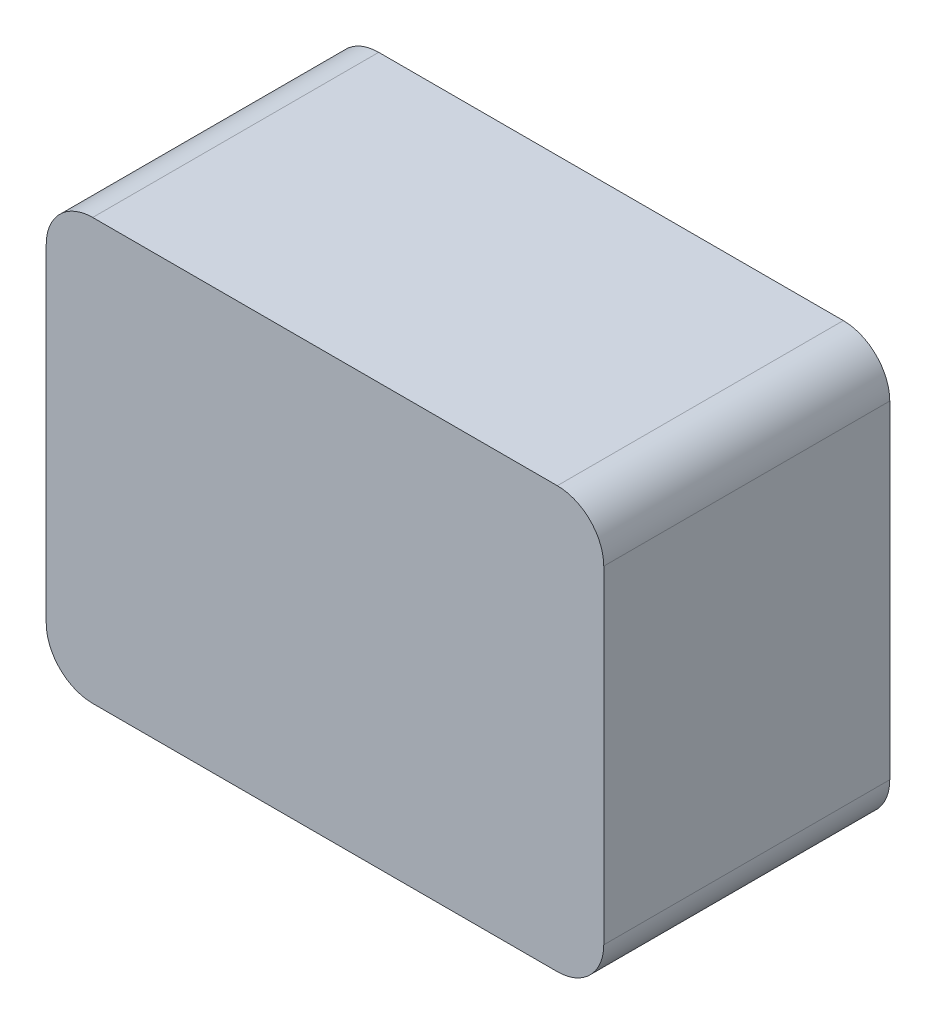
ISO-10303-21;
HEADER;
FILE_DESCRIPTION(('STEP AP214'),'2;1');
FILE_NAME('part.step','',(''),(''),'','','');
FILE_SCHEMA(('AUTOMOTIVE_DESIGN { 1 0 10303 214 1 1 1 1 }'));
ENDSEC;
DATA;
#1=APPLICATION_CONTEXT('core data for automotive mechanical design processes');
#2=APPLICATION_PROTOCOL_DEFINITION('international standard','automotive_design',2000,#1);
#3=PRODUCT_CONTEXT('',#1,'mechanical');
#4=PRODUCT('Part','Part','',(#3));
#5=PRODUCT_RELATED_PRODUCT_CATEGORY('part','',(#4));
#6=PRODUCT_DEFINITION_FORMATION('','',#4);
#7=PRODUCT_DEFINITION_CONTEXT('part definition',#1,'design');
#8=PRODUCT_DEFINITION('design','',#6,#7);
#9=PRODUCT_DEFINITION_SHAPE('','',#8);
#10=(LENGTH_UNIT() NAMED_UNIT(*) SI_UNIT(.MILLI.,.METRE.));
#11=(NAMED_UNIT(*) PLANE_ANGLE_UNIT() SI_UNIT($,.RADIAN.));
#12=(NAMED_UNIT(*) SI_UNIT($,.STERADIAN.) SOLID_ANGLE_UNIT());
#13=UNCERTAINTY_MEASURE_WITH_UNIT(LENGTH_MEASURE(1.E-05),#10,'distance_accuracy_value','');
#14=(GEOMETRIC_REPRESENTATION_CONTEXT(3) GLOBAL_UNCERTAINTY_ASSIGNED_CONTEXT((#13)) GLOBAL_UNIT_ASSIGNED_CONTEXT((#10,
#11,#12)) REPRESENTATION_CONTEXT('',''));
#15=CARTESIAN_POINT('',(0.,0.,0.));
#16=DIRECTION('',(0.,0.,1.));
#17=DIRECTION('',(1.,0.,0.));
#18=AXIS2_PLACEMENT_3D('',#15,#16,#17);
#19=CARTESIAN_POINT('',(32.57432310951,-77.,-240.));
#20=DIRECTION('',(1.,0.,0.));
#21=DIRECTION('',(0.,1.,0.));
#22=AXIS2_PLACEMENT_3D('',#19,#20,#21);
#23=PLANE('',#22);
#24=DIRECTION('',(0.,1.,0.));
#25=VECTOR('',#24,1.);
#26=CARTESIAN_POINT('',(32.57432310951,-77.,-135.352022777));
#27=LINE('',#26,#25);
#28=CARTESIAN_POINT('',(32.57432310951,-60.,-135.352022777));
#29=VERTEX_POINT('',#28);
#30=CARTESIAN_POINT('',(32.57432310951,60.,-135.352022777));
#31=VERTEX_POINT('',#30);
#32=EDGE_CURVE('E202',#29,#31,#27,.T.);
#33=ORIENTED_EDGE('',*,*,#32,.F.);
#34=DIRECTION('',(0.,0.,1.));
#35=VECTOR('',#34,1.);
#36=CARTESIAN_POINT('',(32.57432310951,-60.,-240.));
#37=LINE('',#36,#35);
#38=CARTESIAN_POINT('',(32.57432310951,-60.,-240.));
#39=VERTEX_POINT('',#38);
#40=EDGE_CURVE('E212',#39,#29,#37,.T.);
#41=ORIENTED_EDGE('',*,*,#40,.F.);
#42=DIRECTION('',(0.,1.,0.));
#43=VECTOR('',#42,1.);
#44=CARTESIAN_POINT('',(32.57432310951,-77.,-240.));
#45=LINE('',#44,#43);
#46=CARTESIAN_POINT('',(32.57432310951,60.,-240.));
#47=VERTEX_POINT('',#46);
#48=EDGE_CURVE('E250',#39,#47,#45,.T.);
#49=ORIENTED_EDGE('',*,*,#48,.T.);
#50=DIRECTION('',(0.,0.,1.));
#51=VECTOR('',#50,1.);
#52=CARTESIAN_POINT('',(32.57432310951,60.,-240.));
#53=LINE('',#52,#51);
#54=EDGE_CURVE('E215',#47,#31,#53,.T.);
#55=ORIENTED_EDGE('',*,*,#54,.T.);
#56=EDGE_LOOP('',(#33,#41,#49,#55));
#57=FACE_BOUND('',#56,.T.);
#58=ADVANCED_FACE('F17',(#57),#23,.T.);
#59=CARTESIAN_POINT('',(15.57432310951,60.,-240.));
#60=DIRECTION('',(0.,0.,1.));
#61=DIRECTION('',(1.,0.,0.));
#62=AXIS2_PLACEMENT_3D('',#59,#60,#61);
#63=CYLINDRICAL_SURFACE('',#62,17.);
#64=CARTESIAN_POINT('',(15.57432310951,60.,-240.));
#65=DIRECTION('',(0.,0.,1.));
#66=DIRECTION('',(0.,-1.,0.));
#67=AXIS2_PLACEMENT_3D('',#64,#65,#66);
#68=CIRCLE('',#67,17.);
#69=CARTESIAN_POINT('',(15.57432310951,77.,-240.));
#70=VERTEX_POINT('',#69);
#71=EDGE_CURVE('E211',#47,#70,#68,.T.);
#72=ORIENTED_EDGE('',*,*,#71,.T.);
#73=DIRECTION('',(0.,0.,1.));
#74=VECTOR('',#73,1.);
#75=CARTESIAN_POINT('',(15.57432310951,77.,-240.));
#76=LINE('',#75,#74);
#77=CARTESIAN_POINT('',(15.57432310951,77.,-135.352022777));
#78=VERTEX_POINT('',#77);
#79=EDGE_CURVE('E216',#70,#78,#76,.T.);
#80=ORIENTED_EDGE('',*,*,#79,.T.);
#81=CARTESIAN_POINT('',(15.57432310951,60.,-135.352022777));
#82=DIRECTION('',(0.,0.,1.));
#83=DIRECTION('',(0.,-1.,0.));
#84=AXIS2_PLACEMENT_3D('',#81,#82,#83);
#85=CIRCLE('',#84,17.);
#86=EDGE_CURVE('E204',#31,#78,#85,.T.);
#87=ORIENTED_EDGE('',*,*,#86,.F.);
#88=ORIENTED_EDGE('',*,*,#54,.F.);
#89=EDGE_LOOP('',(#72,#80,#87,#88));
#90=FACE_BOUND('',#89,.T.);
#91=ADVANCED_FACE('F469',(#90),#63,.T.);
#92=CARTESIAN_POINT('',(15.57432310951,-60.,-240.));
#93=DIRECTION('',(0.,0.,1.));
#94=DIRECTION('',(1.,0.,0.));
#95=AXIS2_PLACEMENT_3D('',#92,#93,#94);
#96=CYLINDRICAL_SURFACE('',#95,17.);
#97=ORIENTED_EDGE('',*,*,#40,.T.);
#98=CARTESIAN_POINT('',(15.57432310951,-60.,-135.352022777));
#99=DIRECTION('',(0.,0.,-1.));
#100=DIRECTION('',(0.,-1.,0.));
#101=AXIS2_PLACEMENT_3D('',#98,#99,#100);
#102=CIRCLE('',#101,17.);
#103=CARTESIAN_POINT('',(15.57432310951,-77.,-135.352022777));
#104=VERTEX_POINT('',#103);
#105=EDGE_CURVE('E205',#29,#104,#102,.T.);
#106=ORIENTED_EDGE('',*,*,#105,.T.);
#107=DIRECTION('',(0.,0.,1.));
#108=VECTOR('',#107,1.);
#109=CARTESIAN_POINT('',(15.57432310951,-77.,-240.));
#110=LINE('',#109,#108);
#111=CARTESIAN_POINT('',(15.57432310951,-77.,-240.));
#112=VERTEX_POINT('',#111);
#113=EDGE_CURVE('E273',#112,#104,#110,.T.);
#114=ORIENTED_EDGE('',*,*,#113,.F.);
#115=CARTESIAN_POINT('',(15.57432310951,-60.,-240.));
#116=DIRECTION('',(0.,0.,-1.));
#117=DIRECTION('',(0.,-1.,0.));
#118=AXIS2_PLACEMENT_3D('',#115,#116,#117);
#119=CIRCLE('',#118,17.);
#120=EDGE_CURVE('E245',#39,#112,#119,.T.);
#121=ORIENTED_EDGE('',*,*,#120,.F.);
#122=EDGE_LOOP('',(#97,#106,#114,#121));
#123=FACE_BOUND('',#122,.T.);
#124=ADVANCED_FACE('F478',(#123),#96,.T.);
#125=CARTESIAN_POINT('',(-171.42567689,77.,-240.));
#126=DIRECTION('',(0.,1.,0.));
#127=DIRECTION('',(1.,0.,0.));
#128=AXIS2_PLACEMENT_3D('',#125,#126,#127);
#129=PLANE('',#128);
#130=DIRECTION('',(1.,0.,0.));
#131=VECTOR('',#130,1.);
#132=CARTESIAN_POINT('',(-171.42567689,77.,-240.));
#133=LINE('',#132,#131);
#134=CARTESIAN_POINT('',(-154.42567689,77.,-240.));
#135=VERTEX_POINT('',#134);
#136=EDGE_CURVE('E180',#135,#70,#133,.T.);
#137=ORIENTED_EDGE('',*,*,#136,.F.);
#138=DIRECTION('',(0.,0.,1.));
#139=VECTOR('',#138,1.);
#140=CARTESIAN_POINT('',(-154.42567689,77.,-240.));
#141=LINE('',#140,#139);
#142=CARTESIAN_POINT('',(-154.42567689,77.,-135.352022777));
#143=VERTEX_POINT('',#142);
#144=EDGE_CURVE('E176',#135,#143,#141,.T.);
#145=ORIENTED_EDGE('',*,*,#144,.T.);
#146=DIRECTION('',(1.,0.,0.));
#147=VECTOR('',#146,1.);
#148=CARTESIAN_POINT('',(-171.42567689,77.,-135.352022777));
#149=LINE('',#148,#147);
#150=EDGE_CURVE('E228',#143,#78,#149,.T.);
#151=ORIENTED_EDGE('',*,*,#150,.T.);
#152=ORIENTED_EDGE('',*,*,#79,.F.);
#153=EDGE_LOOP('',(#137,#145,#151,#152));
#154=FACE_BOUND('',#153,.T.);
#155=ADVANCED_FACE('F484',(#154),#129,.T.);
#156=CARTESIAN_POINT('',(-171.42567689,-77.,-240.));
#157=DIRECTION('',(0.,1.,0.));
#158=DIRECTION('',(1.,0.,0.));
#159=AXIS2_PLACEMENT_3D('',#156,#157,#158);
#160=PLANE('',#159);
#161=ORIENTED_EDGE('',*,*,#113,.T.);
#162=DIRECTION('',(1.,0.,0.));
#163=VECTOR('',#162,1.);
#164=CARTESIAN_POINT('',(-171.42567689,-77.,-135.352022777));
#165=LINE('',#164,#163);
#166=CARTESIAN_POINT('',(-154.42567689,-77.,-135.352022777));
#167=VERTEX_POINT('',#166);
#168=EDGE_CURVE('E227',#167,#104,#165,.T.);
#169=ORIENTED_EDGE('',*,*,#168,.F.);
#170=DIRECTION('',(0.,0.,1.));
#171=VECTOR('',#170,1.);
#172=CARTESIAN_POINT('',(-154.42567689,-77.,-240.));
#173=LINE('',#172,#171);
#174=CARTESIAN_POINT('',(-154.42567689,-77.,-240.));
#175=VERTEX_POINT('',#174);
#176=EDGE_CURVE('E219',#175,#167,#173,.T.);
#177=ORIENTED_EDGE('',*,*,#176,.F.);
#178=DIRECTION('',(1.,0.,0.));
#179=VECTOR('',#178,1.);
#180=CARTESIAN_POINT('',(-171.42567689,-77.,-240.));
#181=LINE('',#180,#179);
#182=EDGE_CURVE('E249',#175,#112,#181,.T.);
#183=ORIENTED_EDGE('',*,*,#182,.T.);
#184=EDGE_LOOP('',(#161,#169,#177,#183));
#185=FACE_BOUND('',#184,.T.);
#186=ADVANCED_FACE('F489',(#185),#160,.F.);
#187=CARTESIAN_POINT('',(-171.42567689,-77.,-240.));
#188=DIRECTION('',(0.,0.,1.));
#189=DIRECTION('',(1.,0.,0.));
#190=AXIS2_PLACEMENT_3D('',#187,#188,#189);
#191=PLANE('',#190);
#192=CARTESIAN_POINT('',(-154.42567689,60.,-240.));
#193=DIRECTION('',(0.,0.,-1.));
#194=DIRECTION('',(0.,-1.,0.));
#195=AXIS2_PLACEMENT_3D('',#192,#193,#194);
#196=CIRCLE('',#195,17.);
#197=CARTESIAN_POINT('',(-171.42567689,60.,-240.));
#198=VERTEX_POINT('',#197);
#199=EDGE_CURVE('E170',#198,#135,#196,.T.);
#200=ORIENTED_EDGE('',*,*,#199,.T.);
#201=ORIENTED_EDGE('',*,*,#136,.T.);
#202=ORIENTED_EDGE('',*,*,#71,.F.);
#203=ORIENTED_EDGE('',*,*,#48,.F.);
#204=ORIENTED_EDGE('',*,*,#120,.T.);
#205=ORIENTED_EDGE('',*,*,#182,.F.);
#206=CARTESIAN_POINT('',(-154.42567689,-60.,-240.));
#207=DIRECTION('',(0.,0.,1.));
#208=DIRECTION('',(0.,-1.,0.));
#209=AXIS2_PLACEMENT_3D('',#206,#207,#208);
#210=CIRCLE('',#209,17.);
#211=CARTESIAN_POINT('',(-171.42567689,-60.,-240.));
#212=VERTEX_POINT('',#211);
#213=EDGE_CURVE('E186',#212,#175,#210,.T.);
#214=ORIENTED_EDGE('',*,*,#213,.F.);
#215=DIRECTION('',(0.,1.,0.));
#216=VECTOR('',#215,1.);
#217=CARTESIAN_POINT('',(-171.42567689,-77.,-240.));
#218=LINE('',#217,#216);
#219=EDGE_CURVE('E183',#212,#198,#218,.T.);
#220=ORIENTED_EDGE('',*,*,#219,.T.);
#221=EDGE_LOOP('',(#200,#201,#202,#203,#204,#205,#214,#220));
#222=FACE_BOUND('',#221,.T.);
#223=ADVANCED_FACE('F184',(#222),#191,.F.);
#224=CARTESIAN_POINT('',(-154.42567689,60.,-240.));
#225=DIRECTION('',(0.,0.,1.));
#226=DIRECTION('',(-1.,0.,0.));
#227=AXIS2_PLACEMENT_3D('',#224,#225,#226);
#228=CYLINDRICAL_SURFACE('',#227,17.);
#229=DIRECTION('',(0.,0.,1.));
#230=VECTOR('',#229,1.);
#231=CARTESIAN_POINT('',(-171.42567689,60.,-240.));
#232=LINE('',#231,#230);
#233=CARTESIAN_POINT('',(-171.42567689,60.,-135.352022777));
#234=VERTEX_POINT('',#233);
#235=EDGE_CURVE('E175',#198,#234,#232,.T.);
#236=ORIENTED_EDGE('',*,*,#235,.T.);
#237=CARTESIAN_POINT('',(-154.42567689,60.,-135.352022777));
#238=DIRECTION('',(0.,0.,-1.));
#239=DIRECTION('',(0.,-1.,0.));
#240=AXIS2_PLACEMENT_3D('',#237,#238,#239);
#241=CIRCLE('',#240,17.);
#242=EDGE_CURVE('E220',#234,#143,#241,.T.);
#243=ORIENTED_EDGE('',*,*,#242,.T.);
#244=ORIENTED_EDGE('',*,*,#144,.F.);
#245=ORIENTED_EDGE('',*,*,#199,.F.);
#246=EDGE_LOOP('',(#236,#243,#244,#245));
#247=FACE_BOUND('',#246,.T.);
#248=ADVANCED_FACE('F172',(#247),#228,.T.);
#249=CARTESIAN_POINT('',(-154.42567689,-60.,-240.));
#250=DIRECTION('',(0.,0.,1.));
#251=DIRECTION('',(-1.,0.,0.));
#252=AXIS2_PLACEMENT_3D('',#249,#250,#251);
#253=CYLINDRICAL_SURFACE('',#252,17.);
#254=ORIENTED_EDGE('',*,*,#213,.T.);
#255=ORIENTED_EDGE('',*,*,#176,.T.);
#256=CARTESIAN_POINT('',(-154.42567689,-60.,-135.352022777));
#257=DIRECTION('',(0.,0.,1.));
#258=DIRECTION('',(0.,-1.,0.));
#259=AXIS2_PLACEMENT_3D('',#256,#257,#258);
#260=CIRCLE('',#259,17.);
#261=CARTESIAN_POINT('',(-171.42567689,-60.,-135.352022777));
#262=VERTEX_POINT('',#261);
#263=EDGE_CURVE('E223',#262,#167,#260,.T.);
#264=ORIENTED_EDGE('',*,*,#263,.F.);
#265=DIRECTION('',(0.,0.,1.));
#266=VECTOR('',#265,1.);
#267=CARTESIAN_POINT('',(-171.42567689,-60.,-240.));
#268=LINE('',#267,#266);
#269=EDGE_CURVE('E191',#212,#262,#268,.T.);
#270=ORIENTED_EDGE('',*,*,#269,.F.);
#271=EDGE_LOOP('',(#254,#255,#264,#270));
#272=FACE_BOUND('',#271,.T.);
#273=ADVANCED_FACE('F506',(#272),#253,.T.);
#274=CARTESIAN_POINT('',(-171.42567689,-77.,-135.352022777));
#275=DIRECTION('',(0.,0.,1.));
#276=DIRECTION('',(1.,0.,0.));
#277=AXIS2_PLACEMENT_3D('',#274,#275,#276);
#278=PLANE('',#277);
#279=DIRECTION('',(0.,1.,0.));
#280=VECTOR('',#279,1.);
#281=CARTESIAN_POINT('',(-171.42567689,-77.,-135.352022777));
#282=LINE('',#281,#280);
#283=EDGE_CURVE('E196',#262,#234,#282,.T.);
#284=ORIENTED_EDGE('',*,*,#283,.F.);
#285=ORIENTED_EDGE('',*,*,#263,.T.);
#286=ORIENTED_EDGE('',*,*,#168,.T.);
#287=ORIENTED_EDGE('',*,*,#105,.F.);
#288=ORIENTED_EDGE('',*,*,#32,.T.);
#289=ORIENTED_EDGE('',*,*,#86,.T.);
#290=ORIENTED_EDGE('',*,*,#150,.F.);
#291=ORIENTED_EDGE('',*,*,#242,.F.);
#292=EDGE_LOOP('',(#284,#285,#286,#287,#288,#289,#290,#291));
#293=FACE_BOUND('',#292,.T.);
#294=ADVANCED_FACE('F519',(#293),#278,.T.);
#295=CARTESIAN_POINT('',(-171.42567689,-77.,-240.));
#296=DIRECTION('',(1.,0.,0.));
#297=DIRECTION('',(0.,1.,0.));
#298=AXIS2_PLACEMENT_3D('',#295,#296,#297);
#299=PLANE('',#298);
#300=ORIENTED_EDGE('',*,*,#235,.F.);
#301=ORIENTED_EDGE('',*,*,#219,.F.);
#302=ORIENTED_EDGE('',*,*,#269,.T.);
#303=ORIENTED_EDGE('',*,*,#283,.T.);
#304=EDGE_LOOP('',(#300,#301,#302,#303));
#305=FACE_BOUND('',#304,.T.);
#306=ADVANCED_FACE('F194',(#305),#299,.F.);
#307=CLOSED_SHELL('',(#58,#91,#124,#155,#186,#223,#248,#273,#294,#306));
#308=CARTESIAN_POINT('',(30.57432310951,-75.,-238.));
#309=DIRECTION('',(1.,0.,0.));
#310=DIRECTION('',(0.,1.,0.));
#311=AXIS2_PLACEMENT_3D('',#308,#309,#310);
#312=PLANE('',#311);
#313=DIRECTION('',(0.,0.,1.));
#314=VECTOR('',#313,1.);
#315=CARTESIAN_POINT('',(30.57432310951,60.,-238.));
#316=LINE('',#315,#314);
#317=CARTESIAN_POINT('',(30.57432310951,60.,-238.));
#318=VERTEX_POINT('',#317);
#319=CARTESIAN_POINT('',(30.57432310951,60.,-137.352022777));
#320=VERTEX_POINT('',#319);
#321=EDGE_CURVE('E10',#318,#320,#316,.T.);
#322=ORIENTED_EDGE('',*,*,#321,.F.);
#323=DIRECTION('',(0.,1.,0.));
#324=VECTOR('',#323,1.);
#325=CARTESIAN_POINT('',(30.57432310951,-75.,-238.));
#326=LINE('',#325,#324);
#327=CARTESIAN_POINT('',(30.57432310951,-60.,-238.));
#328=VERTEX_POINT('',#327);
#329=EDGE_CURVE('E333',#328,#318,#326,.T.);
#330=ORIENTED_EDGE('',*,*,#329,.F.);
#331=DIRECTION('',(0.,0.,1.));
#332=VECTOR('',#331,1.);
#333=CARTESIAN_POINT('',(30.57432310951,-60.,-238.));
#334=LINE('',#333,#332);
#335=CARTESIAN_POINT('',(30.57432310951,-60.,-137.352022777));
#336=VERTEX_POINT('',#335);
#337=EDGE_CURVE('E27',#328,#336,#334,.T.);
#338=ORIENTED_EDGE('',*,*,#337,.T.);
#339=DIRECTION('',(0.,1.,0.));
#340=VECTOR('',#339,1.);
#341=CARTESIAN_POINT('',(30.57432310951,-75.,-137.352022777));
#342=LINE('',#341,#340);
#343=EDGE_CURVE('E302',#336,#320,#342,.T.);
#344=ORIENTED_EDGE('',*,*,#343,.T.);
#345=EDGE_LOOP('',(#322,#330,#338,#344));
#346=FACE_BOUND('',#345,.T.);
#347=ADVANCED_FACE('F19',(#346),#312,.F.);
#348=CARTESIAN_POINT('',(15.57432310951,60.,-238.));
#349=DIRECTION('',(0.,0.,1.));
#350=DIRECTION('',(1.,0.,0.));
#351=AXIS2_PLACEMENT_3D('',#348,#349,#350);
#352=CYLINDRICAL_SURFACE('',#351,15.);
#353=ORIENTED_EDGE('',*,*,#321,.T.);
#354=CARTESIAN_POINT('',(15.57432310951,60.,-137.352022777));
#355=DIRECTION('',(0.,0.,1.));
#356=DIRECTION('',(0.,-1.,0.));
#357=AXIS2_PLACEMENT_3D('',#354,#355,#356);
#358=CIRCLE('',#357,15.);
#359=CARTESIAN_POINT('',(15.57432310951,75.,-137.352022777));
#360=VERTEX_POINT('',#359);
#361=EDGE_CURVE('E299',#320,#360,#358,.T.);
#362=ORIENTED_EDGE('',*,*,#361,.T.);
#363=DIRECTION('',(0.,0.,1.));
#364=VECTOR('',#363,1.);
#365=CARTESIAN_POINT('',(15.57432310951,75.,-238.));
#366=LINE('',#365,#364);
#367=CARTESIAN_POINT('',(15.57432310951,75.,-238.));
#368=VERTEX_POINT('',#367);
#369=EDGE_CURVE('E39',#368,#360,#366,.T.);
#370=ORIENTED_EDGE('',*,*,#369,.F.);
#371=CARTESIAN_POINT('',(15.57432310951,60.,-238.));
#372=DIRECTION('',(0.,0.,1.));
#373=DIRECTION('',(0.,-1.,0.));
#374=AXIS2_PLACEMENT_3D('',#371,#372,#373);
#375=CIRCLE('',#374,15.);
#376=EDGE_CURVE('E337',#318,#368,#375,.T.);
#377=ORIENTED_EDGE('',*,*,#376,.F.);
#378=EDGE_LOOP('',(#353,#362,#370,#377));
#379=FACE_BOUND('',#378,.T.);
#380=ADVANCED_FACE('F360',(#379),#352,.F.);
#381=CARTESIAN_POINT('',(15.57432310951,-60.,-238.));
#382=DIRECTION('',(0.,0.,1.));
#383=DIRECTION('',(1.,0.,0.));
#384=AXIS2_PLACEMENT_3D('',#381,#382,#383);
#385=CYLINDRICAL_SURFACE('',#384,15.);
#386=CARTESIAN_POINT('',(15.57432310951,-60.,-238.));
#387=DIRECTION('',(0.,0.,-1.));
#388=DIRECTION('',(0.,-1.,0.));
#389=AXIS2_PLACEMENT_3D('',#386,#387,#388);
#390=CIRCLE('',#389,15.);
#391=CARTESIAN_POINT('',(15.57432310951,-75.,-238.));
#392=VERTEX_POINT('',#391);
#393=EDGE_CURVE('E265',#328,#392,#390,.T.);
#394=ORIENTED_EDGE('',*,*,#393,.T.);
#395=DIRECTION('',(0.,0.,1.));
#396=VECTOR('',#395,1.);
#397=CARTESIAN_POINT('',(15.57432310951,-75.,-238.));
#398=LINE('',#397,#396);
#399=CARTESIAN_POINT('',(15.57432310951,-75.,-137.352022777));
#400=VERTEX_POINT('',#399);
#401=EDGE_CURVE('E344',#392,#400,#398,.T.);
#402=ORIENTED_EDGE('',*,*,#401,.T.);
#403=CARTESIAN_POINT('',(15.57432310951,-60.,-137.352022777));
#404=DIRECTION('',(0.,0.,-1.));
#405=DIRECTION('',(0.,-1.,0.));
#406=AXIS2_PLACEMENT_3D('',#403,#404,#405);
#407=CIRCLE('',#406,15.);
#408=EDGE_CURVE('E305',#336,#400,#407,.T.);
#409=ORIENTED_EDGE('',*,*,#408,.F.);
#410=ORIENTED_EDGE('',*,*,#337,.F.);
#411=EDGE_LOOP('',(#394,#402,#409,#410));
#412=FACE_BOUND('',#411,.T.);
#413=ADVANCED_FACE('F355',(#412),#385,.F.);
#414=CARTESIAN_POINT('',(-169.42567689,75.,-238.));
#415=DIRECTION('',(0.,1.,0.));
#416=DIRECTION('',(1.,0.,0.));
#417=AXIS2_PLACEMENT_3D('',#414,#415,#416);
#418=PLANE('',#417);
#419=ORIENTED_EDGE('',*,*,#369,.T.);
#420=DIRECTION('',(1.,0.,0.));
#421=VECTOR('',#420,1.);
#422=CARTESIAN_POINT('',(-169.42567689,75.,-137.352022777));
#423=LINE('',#422,#421);
#424=CARTESIAN_POINT('',(-154.42567689,75.,-137.352022777));
#425=VERTEX_POINT('',#424);
#426=EDGE_CURVE('E295',#425,#360,#423,.T.);
#427=ORIENTED_EDGE('',*,*,#426,.F.);
#428=DIRECTION('',(0.,0.,1.));
#429=VECTOR('',#428,1.);
#430=CARTESIAN_POINT('',(-154.42567689,75.,-238.));
#431=LINE('',#430,#429);
#432=CARTESIAN_POINT('',(-154.42567689,75.,-238.));
#433=VERTEX_POINT('',#432);
#434=EDGE_CURVE('E266',#433,#425,#431,.T.);
#435=ORIENTED_EDGE('',*,*,#434,.F.);
#436=DIRECTION('',(1.,0.,0.));
#437=VECTOR('',#436,1.);
#438=CARTESIAN_POINT('',(-169.42567689,75.,-238.));
#439=LINE('',#438,#437);
#440=EDGE_CURVE('E341',#433,#368,#439,.T.);
#441=ORIENTED_EDGE('',*,*,#440,.T.);
#442=EDGE_LOOP('',(#419,#427,#435,#441));
#443=FACE_BOUND('',#442,.T.);
#444=ADVANCED_FACE('F378',(#443),#418,.F.);
#445=CARTESIAN_POINT('',(-169.42567689,-75.,-238.));
#446=DIRECTION('',(0.,1.,0.));
#447=DIRECTION('',(1.,0.,0.));
#448=AXIS2_PLACEMENT_3D('',#445,#446,#447);
#449=PLANE('',#448);
#450=DIRECTION('',(1.,0.,0.));
#451=VECTOR('',#450,1.);
#452=CARTESIAN_POINT('',(-169.42567689,-75.,-238.));
#453=LINE('',#452,#451);
#454=CARTESIAN_POINT('',(-154.42567689,-75.,-238.));
#455=VERTEX_POINT('',#454);
#456=EDGE_CURVE('E261',#455,#392,#453,.T.);
#457=ORIENTED_EDGE('',*,*,#456,.F.);
#458=DIRECTION('',(0.,0.,1.));
#459=VECTOR('',#458,1.);
#460=CARTESIAN_POINT('',(-154.42567689,-75.,-238.));
#461=LINE('',#460,#459);
#462=CARTESIAN_POINT('',(-154.42567689,-75.,-137.352022777));
#463=VERTEX_POINT('',#462);
#464=EDGE_CURVE('E317',#455,#463,#461,.T.);
#465=ORIENTED_EDGE('',*,*,#464,.T.);
#466=DIRECTION('',(1.,0.,0.));
#467=VECTOR('',#466,1.);
#468=CARTESIAN_POINT('',(-169.42567689,-75.,-137.352022777));
#469=LINE('',#468,#467);
#470=EDGE_CURVE('E309',#463,#400,#469,.T.);
#471=ORIENTED_EDGE('',*,*,#470,.T.);
#472=ORIENTED_EDGE('',*,*,#401,.F.);
#473=EDGE_LOOP('',(#457,#465,#471,#472));
#474=FACE_BOUND('',#473,.T.);
#475=ADVANCED_FACE('F366',(#474),#449,.T.);
#476=CARTESIAN_POINT('',(-169.42567689,-75.,-238.));
#477=DIRECTION('',(0.,0.,1.));
#478=DIRECTION('',(1.,0.,0.));
#479=AXIS2_PLACEMENT_3D('',#476,#477,#478);
#480=PLANE('',#479);
#481=DIRECTION('',(0.,1.,0.));
#482=VECTOR('',#481,1.);
#483=CARTESIAN_POINT('',(-169.42567689,-75.,-238.));
#484=LINE('',#483,#482);
#485=CARTESIAN_POINT('',(-169.42567689,-60.,-238.));
#486=VERTEX_POINT('',#485);
#487=CARTESIAN_POINT('',(-169.42567689,60.,-238.));
#488=VERTEX_POINT('',#487);
#489=EDGE_CURVE('E283',#486,#488,#484,.T.);
#490=ORIENTED_EDGE('',*,*,#489,.F.);
#491=CARTESIAN_POINT('',(-154.42567689,-60.,-238.));
#492=DIRECTION('',(0.,0.,1.));
#493=DIRECTION('',(0.,-1.,0.));
#494=AXIS2_PLACEMENT_3D('',#491,#492,#493);
#495=CIRCLE('',#494,15.);
#496=EDGE_CURVE('E320',#486,#455,#495,.T.);
#497=ORIENTED_EDGE('',*,*,#496,.T.);
#498=ORIENTED_EDGE('',*,*,#456,.T.);
#499=ORIENTED_EDGE('',*,*,#393,.F.);
#500=ORIENTED_EDGE('',*,*,#329,.T.);
#501=ORIENTED_EDGE('',*,*,#376,.T.);
#502=ORIENTED_EDGE('',*,*,#440,.F.);
#503=CARTESIAN_POINT('',(-154.42567689,60.,-238.));
#504=DIRECTION('',(0.,0.,-1.));
#505=DIRECTION('',(0.,-1.,0.));
#506=AXIS2_PLACEMENT_3D('',#503,#504,#505);
#507=CIRCLE('',#506,15.);
#508=EDGE_CURVE('E323',#488,#433,#507,.T.);
#509=ORIENTED_EDGE('',*,*,#508,.F.);
#510=EDGE_LOOP('',(#490,#497,#498,#499,#500,#501,#502,#509));
#511=FACE_BOUND('',#510,.T.);
#512=ADVANCED_FACE('F363',(#511),#480,.T.);
#513=CARTESIAN_POINT('',(-154.42567689,60.,-238.));
#514=DIRECTION('',(0.,0.,1.));
#515=DIRECTION('',(-1.,0.,0.));
#516=AXIS2_PLACEMENT_3D('',#513,#514,#515);
#517=CYLINDRICAL_SURFACE('',#516,15.);
#518=ORIENTED_EDGE('',*,*,#508,.T.);
#519=ORIENTED_EDGE('',*,*,#434,.T.);
#520=CARTESIAN_POINT('',(-154.42567689,60.,-137.352022777));
#521=DIRECTION('',(0.,0.,-1.));
#522=DIRECTION('',(0.,-1.,0.));
#523=AXIS2_PLACEMENT_3D('',#520,#521,#522);
#524=CIRCLE('',#523,15.);
#525=CARTESIAN_POINT('',(-169.42567689,60.,-137.352022777));
#526=VERTEX_POINT('',#525);
#527=EDGE_CURVE('E291',#526,#425,#524,.T.);
#528=ORIENTED_EDGE('',*,*,#527,.F.);
#529=DIRECTION('',(0.,0.,1.));
#530=VECTOR('',#529,1.);
#531=CARTESIAN_POINT('',(-169.42567689,60.,-238.));
#532=LINE('',#531,#530);
#533=EDGE_CURVE('E287',#488,#526,#532,.T.);
#534=ORIENTED_EDGE('',*,*,#533,.F.);
#535=EDGE_LOOP('',(#518,#519,#528,#534));
#536=FACE_BOUND('',#535,.T.);
#537=ADVANCED_FACE('F375',(#536),#517,.F.);
#538=CARTESIAN_POINT('',(-154.42567689,-60.,-238.));
#539=DIRECTION('',(0.,0.,1.));
#540=DIRECTION('',(-1.,0.,0.));
#541=AXIS2_PLACEMENT_3D('',#538,#539,#540);
#542=CYLINDRICAL_SURFACE('',#541,15.);
#543=DIRECTION('',(0.,0.,1.));
#544=VECTOR('',#543,1.);
#545=CARTESIAN_POINT('',(-169.42567689,-60.,-238.));
#546=LINE('',#545,#544);
#547=CARTESIAN_POINT('',(-169.42567689,-60.,-137.352022777));
#548=VERTEX_POINT('',#547);
#549=EDGE_CURVE('E236',#486,#548,#546,.T.);
#550=ORIENTED_EDGE('',*,*,#549,.T.);
#551=CARTESIAN_POINT('',(-154.42567689,-60.,-137.352022777));
#552=DIRECTION('',(0.,0.,1.));
#553=DIRECTION('',(0.,-1.,0.));
#554=AXIS2_PLACEMENT_3D('',#551,#552,#553);
#555=CIRCLE('',#554,15.);
#556=EDGE_CURVE('E313',#548,#463,#555,.T.);
#557=ORIENTED_EDGE('',*,*,#556,.T.);
#558=ORIENTED_EDGE('',*,*,#464,.F.);
#559=ORIENTED_EDGE('',*,*,#496,.F.);
#560=EDGE_LOOP('',(#550,#557,#558,#559));
#561=FACE_BOUND('',#560,.T.);
#562=ADVANCED_FACE('F370',(#561),#542,.F.);
#563=CARTESIAN_POINT('',(-169.42567689,-75.,-137.352022777));
#564=DIRECTION('',(0.,0.,1.));
#565=DIRECTION('',(1.,0.,0.));
#566=AXIS2_PLACEMENT_3D('',#563,#564,#565);
#567=PLANE('',#566);
#568=ORIENTED_EDGE('',*,*,#527,.T.);
#569=ORIENTED_EDGE('',*,*,#426,.T.);
#570=ORIENTED_EDGE('',*,*,#361,.F.);
#571=ORIENTED_EDGE('',*,*,#343,.F.);
#572=ORIENTED_EDGE('',*,*,#408,.T.);
#573=ORIENTED_EDGE('',*,*,#470,.F.);
#574=ORIENTED_EDGE('',*,*,#556,.F.);
#575=DIRECTION('',(0.,1.,0.));
#576=VECTOR('',#575,1.);
#577=CARTESIAN_POINT('',(-169.42567689,-75.,-137.352022777));
#578=LINE('',#577,#576);
#579=EDGE_CURVE('E232',#548,#526,#578,.T.);
#580=ORIENTED_EDGE('',*,*,#579,.T.);
#581=EDGE_LOOP('',(#568,#569,#570,#571,#572,#573,#574,#580));
#582=FACE_BOUND('',#581,.T.);
#583=ADVANCED_FACE('F358',(#582),#567,.F.);
#584=CARTESIAN_POINT('',(-169.42567689,-75.,-238.));
#585=DIRECTION('',(1.,0.,0.));
#586=DIRECTION('',(0.,1.,0.));
#587=AXIS2_PLACEMENT_3D('',#584,#585,#586);
#588=PLANE('',#587);
#589=ORIENTED_EDGE('',*,*,#579,.F.);
#590=ORIENTED_EDGE('',*,*,#549,.F.);
#591=ORIENTED_EDGE('',*,*,#489,.T.);
#592=ORIENTED_EDGE('',*,*,#533,.T.);
#593=EDGE_LOOP('',(#589,#590,#591,#592));
#594=FACE_BOUND('',#593,.T.);
#595=ADVANCED_FACE('F372',(#594),#588,.T.);
#596=CLOSED_SHELL('',(#347,#380,#413,#444,#475,#512,#537,#562,#583,#595));
#597=ORIENTED_CLOSED_SHELL('',*,#596,.T.);
#598=BREP_WITH_VOIDS('B1',#307,(#597));
#599=ADVANCED_BREP_SHAPE_REPRESENTATION('',(#18,#598),#14);
#600=SHAPE_DEFINITION_REPRESENTATION(#9,#599);
ENDSEC;
END-ISO-10303-21;
